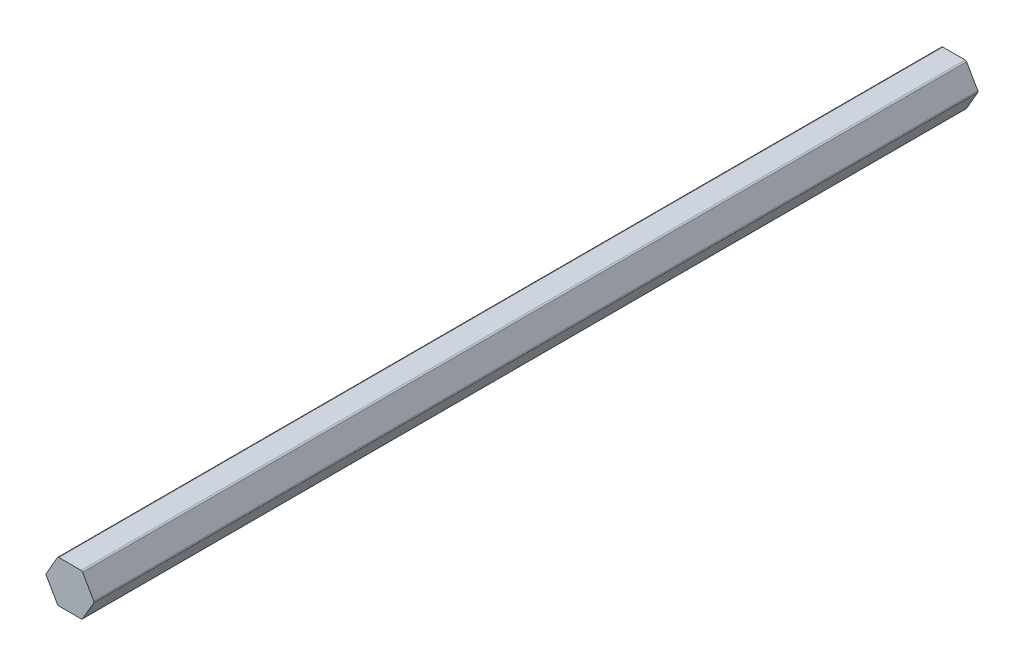
ISO-10303-21;
HEADER;
FILE_DESCRIPTION(('STEP AP214'),'2;1');
FILE_NAME('part.step','',(''),(''),'','','');
FILE_SCHEMA(('AUTOMOTIVE_DESIGN { 1 0 10303 214 1 1 1 1 }'));
ENDSEC;
DATA;
#1=APPLICATION_CONTEXT('core data for automotive mechanical design processes');
#2=APPLICATION_PROTOCOL_DEFINITION('international standard','automotive_design',2000,#1);
#3=PRODUCT_CONTEXT('',#1,'mechanical');
#4=PRODUCT('Part','Part','',(#3));
#5=PRODUCT_RELATED_PRODUCT_CATEGORY('part','',(#4));
#6=PRODUCT_DEFINITION_FORMATION('','',#4);
#7=PRODUCT_DEFINITION_CONTEXT('part definition',#1,'design');
#8=PRODUCT_DEFINITION('design','',#6,#7);
#9=PRODUCT_DEFINITION_SHAPE('','',#8);
#10=(LENGTH_UNIT() NAMED_UNIT(*) SI_UNIT(.MILLI.,.METRE.));
#11=(NAMED_UNIT(*) PLANE_ANGLE_UNIT() SI_UNIT($,.RADIAN.));
#12=(NAMED_UNIT(*) SI_UNIT($,.STERADIAN.) SOLID_ANGLE_UNIT());
#13=UNCERTAINTY_MEASURE_WITH_UNIT(LENGTH_MEASURE(1.E-05),#10,'distance_accuracy_value','');
#14=(GEOMETRIC_REPRESENTATION_CONTEXT(3) GLOBAL_UNCERTAINTY_ASSIGNED_CONTEXT((#13)) GLOBAL_UNIT_ASSIGNED_CONTEXT((#10,
#11,#12)) REPRESENTATION_CONTEXT('',''));
#15=CARTESIAN_POINT('',(0.,0.,0.));
#16=DIRECTION('',(0.,0.,1.));
#17=DIRECTION('',(1.,0.,0.));
#18=AXIS2_PLACEMENT_3D('',#15,#16,#17);
#19=CARTESIAN_POINT('',(-6.73109584837417,0.,457.2));
#20=DIRECTION('',(0.,0.,-1.));
#21=DIRECTION('',(-1.,0.,0.));
#22=AXIS2_PLACEMENT_3D('',#19,#20,#21);
#23=CYLINDRICAL_SURFACE('',#22,0.508);
#24=CARTESIAN_POINT('',(-6.73109584837417,0.,-190.5));
#25=DIRECTION('',(0.,0.,-1.));
#26=DIRECTION('',(-1.,0.,0.));
#27=AXIS2_PLACEMENT_3D('',#24,#25,#26);
#28=CIRCLE('',#27,0.508);
#29=CARTESIAN_POINT('',(-7.23909584837417,0.,-190.5));
#30=VERTEX_POINT('',#29);
#31=CARTESIAN_POINT('',(-7.17103675349666,-0.254000000000007,-190.5));
#32=VERTEX_POINT('',#31);
#33=EDGE_CURVE('E264',#30,#32,#28,.F.);
#34=ORIENTED_EDGE('',*,*,#33,.F.);
#35=DIRECTION('',(0.,0.,-1.));
#36=VECTOR('',#35,1.);
#37=CARTESIAN_POINT('',(-7.23909584837417,0.,457.2));
#38=LINE('',#37,#36);
#39=CARTESIAN_POINT('',(-7.23909584837417,0.,-457.2));
#40=VERTEX_POINT('',#39);
#41=EDGE_CURVE('E52',#30,#40,#38,.T.);
#42=ORIENTED_EDGE('',*,*,#41,.T.);
#43=CARTESIAN_POINT('',(-6.73109584837417,0.,-457.2));
#44=DIRECTION('',(0.,0.,-1.));
#45=DIRECTION('',(1.,0.,0.));
#46=AXIS2_PLACEMENT_3D('',#43,#44,#45);
#47=CIRCLE('',#46,0.508);
#48=CARTESIAN_POINT('',(-7.17103675349666,-0.254000000000004,-457.2));
#49=VERTEX_POINT('',#48);
#50=EDGE_CURVE('E192',#49,#40,#47,.T.);
#51=ORIENTED_EDGE('',*,*,#50,.F.);
#52=DIRECTION('',(0.,0.,-1.));
#53=VECTOR('',#52,1.);
#54=CARTESIAN_POINT('',(-7.17103675349666,-0.254000000000004,457.2));
#55=LINE('',#54,#53);
#56=EDGE_CURVE('E217',#32,#49,#55,.T.);
#57=ORIENTED_EDGE('',*,*,#56,.F.);
#58=EDGE_LOOP('',(#34,#42,#51,#57));
#59=FACE_BOUND('',#58,.T.);
#60=ADVANCED_FACE('F44',(#59),#23,.T.);
#61=CARTESIAN_POINT('',(3.65884186093541,-6.3373,457.2));
#62=DIRECTION('',(-0.866025403784439,0.5,0.));
#63=DIRECTION('',(0.,0.,1.));
#64=AXIS2_PLACEMENT_3D('',#61,#62,#63);
#65=PLANE('',#64);
#66=DIRECTION('',(0.,0.,1.));
#67=VECTOR('',#66,1.);
#68=CARTESIAN_POINT('',(7.17103675349667,-0.253999999999996,457.2));
#69=LINE('',#68,#67);
#70=CARTESIAN_POINT('',(7.17103675349666,-0.254,-457.2));
#71=VERTEX_POINT('',#70);
#72=CARTESIAN_POINT('',(7.17103675349666,-0.254000000000001,-190.5));
#73=VERTEX_POINT('',#72);
#74=EDGE_CURVE('E179',#71,#73,#69,.T.);
#75=ORIENTED_EDGE('',*,*,#74,.T.);
#76=DIRECTION('',(-0.5,-0.866025403784439,0.));
#77=VECTOR('',#76,1.);
#78=CARTESIAN_POINT('',(3.65884186093541,-6.3373,-190.5));
#79=LINE('',#78,#77);
#80=CARTESIAN_POINT('',(3.80548882930958,-6.0833,-190.5));
#81=VERTEX_POINT('',#80);
#82=EDGE_CURVE('E254',#73,#81,#79,.T.);
#83=ORIENTED_EDGE('',*,*,#82,.T.);
#84=DIRECTION('',(0.,0.,-1.));
#85=VECTOR('',#84,1.);
#86=CARTESIAN_POINT('',(3.80548882930958,-6.0833,457.2));
#87=LINE('',#86,#85);
#88=CARTESIAN_POINT('',(3.80548882930958,-6.0833,-457.2));
#89=VERTEX_POINT('',#88);
#90=EDGE_CURVE('E209',#81,#89,#87,.T.);
#91=ORIENTED_EDGE('',*,*,#90,.T.);
#92=DIRECTION('',(0.5,0.866025403784439,0.));
#93=VECTOR('',#92,1.);
#94=CARTESIAN_POINT('',(3.65884186093541,-6.3373,-457.2));
#95=LINE('',#94,#93);
#96=EDGE_CURVE('E205',#89,#71,#95,.T.);
#97=ORIENTED_EDGE('',*,*,#96,.T.);
#98=EDGE_LOOP('',(#75,#83,#91,#97));
#99=FACE_BOUND('',#98,.T.);
#100=ADVANCED_FACE('F293',(#99),#65,.F.);
#101=CARTESIAN_POINT('',(7.31768372187083,0.,457.2));
#102=DIRECTION('',(-0.866025403784439,-0.5,0.));
#103=DIRECTION('',(-0.5,0.866025403784439,0.));
#104=AXIS2_PLACEMENT_3D('',#101,#102,#103);
#105=PLANE('',#104);
#106=DIRECTION('',(0.,0.,1.));
#107=VECTOR('',#106,1.);
#108=CARTESIAN_POINT('',(3.80548882930958,6.0833,457.2));
#109=LINE('',#108,#107);
#110=CARTESIAN_POINT('',(3.80548882930957,6.0833,-457.2));
#111=VERTEX_POINT('',#110);
#112=CARTESIAN_POINT('',(3.80548882930958,6.0833,-190.5));
#113=VERTEX_POINT('',#112);
#114=EDGE_CURVE('E187',#111,#113,#109,.T.);
#115=ORIENTED_EDGE('',*,*,#114,.T.);
#116=DIRECTION('',(0.5,-0.866025403784439,0.));
#117=VECTOR('',#116,1.);
#118=CARTESIAN_POINT('',(7.31768372187083,0.,-190.5));
#119=LINE('',#118,#117);
#120=CARTESIAN_POINT('',(7.17103675349667,0.254000000000004,-190.5));
#121=VERTEX_POINT('',#120);
#122=EDGE_CURVE('E58',#113,#121,#119,.T.);
#123=ORIENTED_EDGE('',*,*,#122,.T.);
#124=DIRECTION('',(0.,0.,-1.));
#125=VECTOR('',#124,1.);
#126=CARTESIAN_POINT('',(7.17103675349666,0.254,457.2));
#127=LINE('',#126,#125);
#128=CARTESIAN_POINT('',(7.17103675349666,0.254000000000004,-457.2));
#129=VERTEX_POINT('',#128);
#130=EDGE_CURVE('E181',#121,#129,#127,.T.);
#131=ORIENTED_EDGE('',*,*,#130,.T.);
#132=DIRECTION('',(-0.5,0.866025403784439,0.));
#133=VECTOR('',#132,1.);
#134=CARTESIAN_POINT('',(7.31768372187083,0.,-457.2));
#135=LINE('',#134,#133);
#136=EDGE_CURVE('E183',#129,#111,#135,.T.);
#137=ORIENTED_EDGE('',*,*,#136,.T.);
#138=EDGE_LOOP('',(#115,#123,#131,#137));
#139=FACE_BOUND('',#138,.T.);
#140=ADVANCED_FACE('F298',(#139),#105,.F.);
#141=CARTESIAN_POINT('',(3.65884186093541,6.3373,457.2));
#142=DIRECTION('',(0.,-1.,0.));
#143=DIRECTION('',(0.,0.,-1.));
#144=AXIS2_PLACEMENT_3D('',#141,#142,#143);
#145=PLANE('',#144);
#146=DIRECTION('',(0.,0.,1.));
#147=VECTOR('',#146,1.);
#148=CARTESIAN_POINT('',(-3.36554792418709,6.3373,457.2));
#149=LINE('',#148,#147);
#150=CARTESIAN_POINT('',(-3.36554792418708,6.3373,-457.2));
#151=VERTEX_POINT('',#150);
#152=CARTESIAN_POINT('',(-3.36554792418708,6.3373,-190.5));
#153=VERTEX_POINT('',#152);
#154=EDGE_CURVE('E162',#151,#153,#149,.T.);
#155=ORIENTED_EDGE('',*,*,#154,.T.);
#156=DIRECTION('',(1.,0.,0.));
#157=VECTOR('',#156,1.);
#158=CARTESIAN_POINT('',(3.65884186093541,6.3373,-190.5));
#159=LINE('',#158,#157);
#160=CARTESIAN_POINT('',(3.36554792418709,6.3373,-190.5));
#161=VERTEX_POINT('',#160);
#162=EDGE_CURVE('E152',#153,#161,#159,.T.);
#163=ORIENTED_EDGE('',*,*,#162,.T.);
#164=DIRECTION('',(0.,0.,-1.));
#165=VECTOR('',#164,1.);
#166=CARTESIAN_POINT('',(3.36554792418709,6.3373,457.2));
#167=LINE('',#166,#165);
#168=CARTESIAN_POINT('',(3.36554792418709,6.3373,-457.2));
#169=VERTEX_POINT('',#168);
#170=EDGE_CURVE('E160',#161,#169,#167,.T.);
#171=ORIENTED_EDGE('',*,*,#170,.T.);
#172=DIRECTION('',(-1.,0.,0.));
#173=VECTOR('',#172,1.);
#174=CARTESIAN_POINT('',(3.65884186093541,6.3373,-457.2));
#175=LINE('',#174,#173);
#176=EDGE_CURVE('E171',#169,#151,#175,.T.);
#177=ORIENTED_EDGE('',*,*,#176,.T.);
#178=EDGE_LOOP('',(#155,#163,#171,#177));
#179=FACE_BOUND('',#178,.T.);
#180=ADVANCED_FACE('F46',(#179),#145,.F.);
#181=CARTESIAN_POINT('',(-3.65884186093541,6.3373,457.2));
#182=DIRECTION('',(0.866025403784439,-0.5,0.));
#183=DIRECTION('',(0.,0.,-1.));
#184=AXIS2_PLACEMENT_3D('',#181,#182,#183);
#185=PLANE('',#184);
#186=DIRECTION('',(0.,0.,1.));
#187=VECTOR('',#186,1.);
#188=CARTESIAN_POINT('',(-7.17103675349666,0.253999999999995,457.2));
#189=LINE('',#188,#187);
#190=CARTESIAN_POINT('',(-7.17103675349666,0.253999999999997,-457.2));
#191=VERTEX_POINT('',#190);
#192=CARTESIAN_POINT('',(-7.17103675349667,0.253999999999996,-190.5));
#193=VERTEX_POINT('',#192);
#194=EDGE_CURVE('E175',#191,#193,#189,.T.);
#195=ORIENTED_EDGE('',*,*,#194,.T.);
#196=DIRECTION('',(0.5,0.866025403784439,0.));
#197=VECTOR('',#196,1.);
#198=CARTESIAN_POINT('',(-3.65884186093541,6.3373,-190.5));
#199=LINE('',#198,#197);
#200=CARTESIAN_POINT('',(-3.80548882930958,6.0833,-190.5));
#201=VERTEX_POINT('',#200);
#202=EDGE_CURVE('E249',#193,#201,#199,.T.);
#203=ORIENTED_EDGE('',*,*,#202,.T.);
#204=DIRECTION('',(0.,0.,-1.));
#205=VECTOR('',#204,1.);
#206=CARTESIAN_POINT('',(-3.80548882930958,6.0833,457.2));
#207=LINE('',#206,#205);
#208=CARTESIAN_POINT('',(-3.80548882930958,6.0833,-457.2));
#209=VERTEX_POINT('',#208);
#210=EDGE_CURVE('E224',#201,#209,#207,.T.);
#211=ORIENTED_EDGE('',*,*,#210,.T.);
#212=DIRECTION('',(-0.5,-0.866025403784439,0.));
#213=VECTOR('',#212,1.);
#214=CARTESIAN_POINT('',(-3.65884186093541,6.3373,-457.2));
#215=LINE('',#214,#213);
#216=EDGE_CURVE('E168',#209,#191,#215,.T.);
#217=ORIENTED_EDGE('',*,*,#216,.T.);
#218=EDGE_LOOP('',(#195,#203,#211,#217));
#219=FACE_BOUND('',#218,.T.);
#220=ADVANCED_FACE('F291',(#219),#185,.F.);
#221=CARTESIAN_POINT('',(-7.31768372187083,0.,457.2));
#222=DIRECTION('',(0.866025403784438,0.5,0.));
#223=DIRECTION('',(0.,0.,-1.));
#224=AXIS2_PLACEMENT_3D('',#221,#222,#223);
#225=PLANE('',#224);
#226=DIRECTION('',(0.,0.,1.));
#227=VECTOR('',#226,1.);
#228=CARTESIAN_POINT('',(-3.80548882930957,-6.0833,457.2));
#229=LINE('',#228,#227);
#230=CARTESIAN_POINT('',(-3.80548882930957,-6.0833,-457.2));
#231=VERTEX_POINT('',#230);
#232=CARTESIAN_POINT('',(-3.80548882930958,-6.0833,-190.5));
#233=VERTEX_POINT('',#232);
#234=EDGE_CURVE('E213',#231,#233,#229,.T.);
#235=ORIENTED_EDGE('',*,*,#234,.T.);
#236=DIRECTION('',(-0.5,0.866025403784438,0.));
#237=VECTOR('',#236,1.);
#238=CARTESIAN_POINT('',(-7.31768372187083,0.,-190.5));
#239=LINE('',#238,#237);
#240=EDGE_CURVE('E268',#233,#32,#239,.T.);
#241=ORIENTED_EDGE('',*,*,#240,.T.);
#242=ORIENTED_EDGE('',*,*,#56,.T.);
#243=DIRECTION('',(0.5,-0.866025403784439,0.));
#244=VECTOR('',#243,1.);
#245=CARTESIAN_POINT('',(-7.31768372187083,0.,-457.2));
#246=LINE('',#245,#244);
#247=EDGE_CURVE('E216',#49,#231,#246,.T.);
#248=ORIENTED_EDGE('',*,*,#247,.T.);
#249=EDGE_LOOP('',(#235,#241,#242,#248));
#250=FACE_BOUND('',#249,.T.);
#251=ADVANCED_FACE('F307',(#250),#225,.F.);
#252=CARTESIAN_POINT('',(-3.6588418609354,-6.3373,457.2));
#253=DIRECTION('',(0.,1.,0.));
#254=DIRECTION('',(1.,0.,0.));
#255=AXIS2_PLACEMENT_3D('',#252,#253,#254);
#256=PLANE('',#255);
#257=DIRECTION('',(0.,0.,1.));
#258=VECTOR('',#257,1.);
#259=CARTESIAN_POINT('',(3.36554792418709,-6.3373,457.2));
#260=LINE('',#259,#258);
#261=CARTESIAN_POINT('',(3.36554792418709,-6.3373,-457.2));
#262=VERTEX_POINT('',#261);
#263=CARTESIAN_POINT('',(3.36554792418709,-6.3373,-190.5));
#264=VERTEX_POINT('',#263);
#265=EDGE_CURVE('E191',#262,#264,#260,.T.);
#266=ORIENTED_EDGE('',*,*,#265,.T.);
#267=DIRECTION('',(-1.,0.,0.));
#268=VECTOR('',#267,1.);
#269=CARTESIAN_POINT('',(-3.6588418609354,-6.3373,-190.5));
#270=LINE('',#269,#268);
#271=CARTESIAN_POINT('',(-3.36554792418708,-6.3373,-190.5));
#272=VERTEX_POINT('',#271);
#273=EDGE_CURVE('E261',#264,#272,#270,.T.);
#274=ORIENTED_EDGE('',*,*,#273,.T.);
#275=DIRECTION('',(0.,0.,-1.));
#276=VECTOR('',#275,1.);
#277=CARTESIAN_POINT('',(-3.36554792418708,-6.3373,457.2));
#278=LINE('',#277,#276);
#279=CARTESIAN_POINT('',(-3.36554792418708,-6.3373,-457.2));
#280=VERTEX_POINT('',#279);
#281=EDGE_CURVE('E226',#272,#280,#278,.T.);
#282=ORIENTED_EDGE('',*,*,#281,.T.);
#283=DIRECTION('',(1.,0.,0.));
#284=VECTOR('',#283,1.);
#285=CARTESIAN_POINT('',(-3.6588418609354,-6.3373,-457.2));
#286=LINE('',#285,#284);
#287=EDGE_CURVE('E197',#280,#262,#286,.T.);
#288=ORIENTED_EDGE('',*,*,#287,.T.);
#289=EDGE_LOOP('',(#266,#274,#282,#288));
#290=FACE_BOUND('',#289,.T.);
#291=ADVANCED_FACE('F310',(#290),#256,.F.);
#292=CARTESIAN_POINT('',(7.31768372187083,0.,-457.2));
#293=DIRECTION('',(0.,0.,1.));
#294=DIRECTION('',(1.,0.,0.));
#295=AXIS2_PLACEMENT_3D('',#292,#293,#294);
#296=PLANE('',#295);
#297=ORIENTED_EDGE('',*,*,#287,.F.);
#298=CARTESIAN_POINT('',(-3.36554792418708,-5.8293,-457.2));
#299=DIRECTION('',(0.,0.,-1.));
#300=DIRECTION('',(1.,0.,0.));
#301=AXIS2_PLACEMENT_3D('',#298,#299,#300);
#302=CIRCLE('',#301,0.508);
#303=EDGE_CURVE('E188',#280,#231,#302,.T.);
#304=ORIENTED_EDGE('',*,*,#303,.T.);
#305=ORIENTED_EDGE('',*,*,#247,.F.);
#306=ORIENTED_EDGE('',*,*,#50,.T.);
#307=CARTESIAN_POINT('',(-6.73109584837417,0.,-457.2));
#308=DIRECTION('',(0.,0.,-1.));
#309=DIRECTION('',(1.,0.,0.));
#310=AXIS2_PLACEMENT_3D('',#307,#308,#309);
#311=CIRCLE('',#310,0.508);
#312=EDGE_CURVE('E203',#40,#191,#311,.T.);
#313=ORIENTED_EDGE('',*,*,#312,.T.);
#314=ORIENTED_EDGE('',*,*,#216,.F.);
#315=CARTESIAN_POINT('',(-3.36554792418709,5.8293,-457.2));
#316=DIRECTION('',(0.,0.,-1.));
#317=DIRECTION('',(1.,0.,0.));
#318=AXIS2_PLACEMENT_3D('',#315,#316,#317);
#319=CIRCLE('',#318,0.508);
#320=EDGE_CURVE('E200',#209,#151,#319,.T.);
#321=ORIENTED_EDGE('',*,*,#320,.T.);
#322=ORIENTED_EDGE('',*,*,#176,.F.);
#323=CARTESIAN_POINT('',(3.36554792418709,5.8293,-457.2));
#324=DIRECTION('',(0.,0.,-1.));
#325=DIRECTION('',(1.,0.,0.));
#326=AXIS2_PLACEMENT_3D('',#323,#324,#325);
#327=CIRCLE('',#326,0.508);
#328=EDGE_CURVE('E167',#169,#111,#327,.T.);
#329=ORIENTED_EDGE('',*,*,#328,.T.);
#330=ORIENTED_EDGE('',*,*,#136,.F.);
#331=CARTESIAN_POINT('',(6.73109584837417,0.,-457.2));
#332=DIRECTION('',(0.,0.,-1.));
#333=DIRECTION('',(1.,0.,0.));
#334=AXIS2_PLACEMENT_3D('',#331,#332,#333);
#335=CIRCLE('',#334,0.508);
#336=EDGE_CURVE('E212',#129,#71,#335,.T.);
#337=ORIENTED_EDGE('',*,*,#336,.T.);
#338=ORIENTED_EDGE('',*,*,#96,.F.);
#339=CARTESIAN_POINT('',(3.36554792418709,-5.8293,-457.2));
#340=DIRECTION('',(0.,0.,-1.));
#341=DIRECTION('',(1.,0.,0.));
#342=AXIS2_PLACEMENT_3D('',#339,#340,#341);
#343=CIRCLE('',#342,0.508);
#344=EDGE_CURVE('E270',#89,#262,#343,.T.);
#345=ORIENTED_EDGE('',*,*,#344,.T.);
#346=EDGE_LOOP('',(#297,#304,#305,#306,#313,#314,#321,#322,#329,#330,#337,#338,#345));
#347=FACE_BOUND('',#346,.T.);
#348=ADVANCED_FACE('F240',(#347),#296,.F.);
#349=CARTESIAN_POINT('',(-3.36554792418708,-5.8293,457.2));
#350=DIRECTION('',(0.,0.,-1.));
#351=DIRECTION('',(-1.,0.,0.));
#352=AXIS2_PLACEMENT_3D('',#349,#350,#351);
#353=CYLINDRICAL_SURFACE('',#352,0.508);
#354=CARTESIAN_POINT('',(-3.36554792418708,-5.8293,-190.5));
#355=DIRECTION('',(0.,0.,-1.));
#356=DIRECTION('',(-1.,0.,0.));
#357=AXIS2_PLACEMENT_3D('',#354,#355,#356);
#358=CIRCLE('',#357,0.508);
#359=EDGE_CURVE('E266',#233,#272,#358,.F.);
#360=ORIENTED_EDGE('',*,*,#359,.F.);
#361=ORIENTED_EDGE('',*,*,#234,.F.);
#362=ORIENTED_EDGE('',*,*,#303,.F.);
#363=ORIENTED_EDGE('',*,*,#281,.F.);
#364=EDGE_LOOP('',(#360,#361,#362,#363));
#365=FACE_BOUND('',#364,.T.);
#366=ADVANCED_FACE('F303',(#365),#353,.T.);
#367=CARTESIAN_POINT('',(-6.73109584837417,0.,457.2));
#368=DIRECTION('',(0.,0.,-1.));
#369=DIRECTION('',(-1.,0.,0.));
#370=AXIS2_PLACEMENT_3D('',#367,#368,#369);
#371=CYLINDRICAL_SURFACE('',#370,0.508);
#372=CARTESIAN_POINT('',(-6.73109584837417,0.,-190.5));
#373=DIRECTION('',(0.,0.,-1.));
#374=DIRECTION('',(-1.,0.,0.));
#375=AXIS2_PLACEMENT_3D('',#372,#373,#374);
#376=CIRCLE('',#375,0.508);
#377=EDGE_CURVE('E259',#193,#30,#376,.F.);
#378=ORIENTED_EDGE('',*,*,#377,.F.);
#379=ORIENTED_EDGE('',*,*,#194,.F.);
#380=ORIENTED_EDGE('',*,*,#312,.F.);
#381=ORIENTED_EDGE('',*,*,#41,.F.);
#382=EDGE_LOOP('',(#378,#379,#380,#381));
#383=FACE_BOUND('',#382,.T.);
#384=ADVANCED_FACE('F289',(#383),#371,.T.);
#385=CARTESIAN_POINT('',(3.36554792418709,-5.8293,457.2));
#386=DIRECTION('',(0.,0.,-1.));
#387=DIRECTION('',(-1.,0.,0.));
#388=AXIS2_PLACEMENT_3D('',#385,#386,#387);
#389=CYLINDRICAL_SURFACE('',#388,0.508);
#390=CARTESIAN_POINT('',(3.36554792418709,-5.8293,-190.5));
#391=DIRECTION('',(0.,0.,-1.));
#392=DIRECTION('',(-1.,0.,0.));
#393=AXIS2_PLACEMENT_3D('',#390,#391,#392);
#394=CIRCLE('',#393,0.508);
#395=EDGE_CURVE('E257',#264,#81,#394,.F.);
#396=ORIENTED_EDGE('',*,*,#395,.F.);
#397=ORIENTED_EDGE('',*,*,#265,.F.);
#398=ORIENTED_EDGE('',*,*,#344,.F.);
#399=ORIENTED_EDGE('',*,*,#90,.F.);
#400=EDGE_LOOP('',(#396,#397,#398,#399));
#401=FACE_BOUND('',#400,.T.);
#402=ADVANCED_FACE('F311',(#401),#389,.T.);
#403=CARTESIAN_POINT('',(6.73109584837417,0.,457.2));
#404=DIRECTION('',(0.,0.,-1.));
#405=DIRECTION('',(-1.,0.,0.));
#406=AXIS2_PLACEMENT_3D('',#403,#404,#405);
#407=CYLINDRICAL_SURFACE('',#406,0.508);
#408=CARTESIAN_POINT('',(6.73109584837417,0.,-190.5));
#409=DIRECTION('',(0.,0.,-1.));
#410=DIRECTION('',(-1.,0.,0.));
#411=AXIS2_PLACEMENT_3D('',#408,#409,#410);
#412=CIRCLE('',#411,0.508);
#413=EDGE_CURVE('E247',#73,#121,#412,.F.);
#414=ORIENTED_EDGE('',*,*,#413,.F.);
#415=ORIENTED_EDGE('',*,*,#74,.F.);
#416=ORIENTED_EDGE('',*,*,#336,.F.);
#417=ORIENTED_EDGE('',*,*,#130,.F.);
#418=EDGE_LOOP('',(#414,#415,#416,#417));
#419=FACE_BOUND('',#418,.T.);
#420=ADVANCED_FACE('F313',(#419),#407,.T.);
#421=CARTESIAN_POINT('',(-3.36554792418709,5.8293,457.2));
#422=DIRECTION('',(0.,0.,-1.));
#423=DIRECTION('',(-1.,0.,0.));
#424=AXIS2_PLACEMENT_3D('',#421,#422,#423);
#425=CYLINDRICAL_SURFACE('',#424,0.508);
#426=CARTESIAN_POINT('',(-3.36554792418709,5.8293,-190.5));
#427=DIRECTION('',(0.,0.,-1.));
#428=DIRECTION('',(-1.,0.,0.));
#429=AXIS2_PLACEMENT_3D('',#426,#427,#428);
#430=CIRCLE('',#429,0.508);
#431=EDGE_CURVE('E245',#153,#201,#430,.F.);
#432=ORIENTED_EDGE('',*,*,#431,.F.);
#433=ORIENTED_EDGE('',*,*,#154,.F.);
#434=ORIENTED_EDGE('',*,*,#320,.F.);
#435=ORIENTED_EDGE('',*,*,#210,.F.);
#436=EDGE_LOOP('',(#432,#433,#434,#435));
#437=FACE_BOUND('',#436,.T.);
#438=ADVANCED_FACE('F244',(#437),#425,.T.);
#439=CARTESIAN_POINT('',(3.36554792418709,5.8293,457.2));
#440=DIRECTION('',(0.,0.,-1.));
#441=DIRECTION('',(-1.,0.,0.));
#442=AXIS2_PLACEMENT_3D('',#439,#440,#441);
#443=CYLINDRICAL_SURFACE('',#442,0.508);
#444=CARTESIAN_POINT('',(3.36554792418709,5.8293,-190.5));
#445=DIRECTION('',(0.,0.,-1.));
#446=DIRECTION('',(-1.,0.,0.));
#447=AXIS2_PLACEMENT_3D('',#444,#445,#446);
#448=CIRCLE('',#447,0.508);
#449=EDGE_CURVE('E11',#113,#161,#448,.F.);
#450=ORIENTED_EDGE('',*,*,#449,.F.);
#451=ORIENTED_EDGE('',*,*,#114,.F.);
#452=ORIENTED_EDGE('',*,*,#328,.F.);
#453=ORIENTED_EDGE('',*,*,#170,.F.);
#454=EDGE_LOOP('',(#450,#451,#452,#453));
#455=FACE_BOUND('',#454,.T.);
#456=ADVANCED_FACE('F165',(#455),#443,.T.);
#457=CARTESIAN_POINT('',(0.,0.,-190.5));
#458=DIRECTION('',(0.,0.,-1.));
#459=DIRECTION('',(-1.,0.,0.));
#460=AXIS2_PLACEMENT_3D('',#457,#458,#459);
#461=PLANE('',#460);
#462=ORIENTED_EDGE('',*,*,#359,.T.);
#463=ORIENTED_EDGE('',*,*,#273,.F.);
#464=ORIENTED_EDGE('',*,*,#395,.T.);
#465=ORIENTED_EDGE('',*,*,#82,.F.);
#466=ORIENTED_EDGE('',*,*,#413,.T.);
#467=ORIENTED_EDGE('',*,*,#122,.F.);
#468=ORIENTED_EDGE('',*,*,#449,.T.);
#469=ORIENTED_EDGE('',*,*,#162,.F.);
#470=ORIENTED_EDGE('',*,*,#431,.T.);
#471=ORIENTED_EDGE('',*,*,#202,.F.);
#472=ORIENTED_EDGE('',*,*,#377,.T.);
#473=ORIENTED_EDGE('',*,*,#33,.T.);
#474=ORIENTED_EDGE('',*,*,#240,.F.);
#475=EDGE_LOOP('',(#462,#463,#464,#465,#466,#467,#468,#469,#470,#471,#472,#473,#474));
#476=FACE_BOUND('',#475,.T.);
#477=ADVANCED_FACE('F151',(#476),#461,.F.);
#478=CLOSED_SHELL('',(#60,#100,#140,#180,#220,#251,#291,#348,#366,#384,#402,#420,#438,#456,#477));
#479=MANIFOLD_SOLID_BREP('B2',#478);
#480=ADVANCED_BREP_SHAPE_REPRESENTATION('',(#18,#479),#14);
#481=SHAPE_DEFINITION_REPRESENTATION(#9,#480);
ENDSEC;
END-ISO-10303-21;
